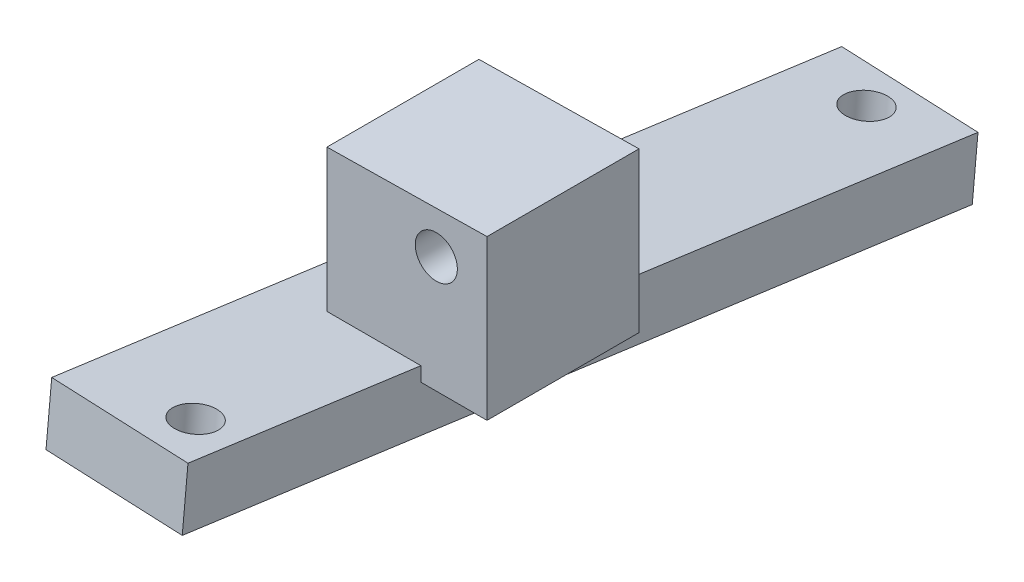
ISO-10303-21;
HEADER;
FILE_DESCRIPTION(('STEP AP214'),'2;1');
FILE_NAME('part.step','',(''),(''),'','','');
FILE_SCHEMA(('AUTOMOTIVE_DESIGN { 1 0 10303 214 1 1 1 1 }'));
ENDSEC;
DATA;
#1=APPLICATION_CONTEXT('core data for automotive mechanical design processes');
#2=APPLICATION_PROTOCOL_DEFINITION('international standard','automotive_design',2000,#1);
#3=PRODUCT_CONTEXT('',#1,'mechanical');
#4=PRODUCT('Part','Part','',(#3));
#5=PRODUCT_RELATED_PRODUCT_CATEGORY('part','',(#4));
#6=PRODUCT_DEFINITION_FORMATION('','',#4);
#7=PRODUCT_DEFINITION_CONTEXT('part definition',#1,'design');
#8=PRODUCT_DEFINITION('design','',#6,#7);
#9=PRODUCT_DEFINITION_SHAPE('','',#8);
#10=(LENGTH_UNIT() NAMED_UNIT(*) SI_UNIT(.MILLI.,.METRE.));
#11=(NAMED_UNIT(*) PLANE_ANGLE_UNIT() SI_UNIT($,.RADIAN.));
#12=(NAMED_UNIT(*) SI_UNIT($,.STERADIAN.) SOLID_ANGLE_UNIT());
#13=UNCERTAINTY_MEASURE_WITH_UNIT(LENGTH_MEASURE(1.E-05),#10,'distance_accuracy_value','');
#14=(GEOMETRIC_REPRESENTATION_CONTEXT(3) GLOBAL_UNCERTAINTY_ASSIGNED_CONTEXT((#13)) GLOBAL_UNIT_ASSIGNED_CONTEXT((#10,
#11,#12)) REPRESENTATION_CONTEXT('',''));
#15=CARTESIAN_POINT('',(0.,0.,0.));
#16=DIRECTION('',(0.,0.,1.));
#17=DIRECTION('',(1.,0.,0.));
#18=AXIS2_PLACEMENT_3D('',#15,#16,#17);
#19=CARTESIAN_POINT('',(0.,0.,0.));
#20=DIRECTION('',(0.,0.,-1.));
#21=DIRECTION('',(1.,0.,0.));
#22=AXIS2_PLACEMENT_3D('',#19,#20,#21);
#23=PLANE('',#22);
#24=DIRECTION('',(0.,1.,0.));
#25=VECTOR('',#24,1.);
#26=CARTESIAN_POINT('',(-277.356124968702,241.722821642749,0.));
#27=LINE('',#26,#25);
#28=CARTESIAN_POINT('',(-277.356124968702,240.280672700296,0.));
#29=VERTEX_POINT('',#28);
#30=CARTESIAN_POINT('',(-277.356124968702,264.279078056228,0.));
#31=VERTEX_POINT('',#30);
#32=EDGE_CURVE('E163',#29,#31,#27,.T.);
#33=ORIENTED_EDGE('',*,*,#32,.T.);
#34=DIRECTION('',(-0.999876642654605,-0.0157066697220126,0.));
#35=VECTOR('',#34,1.);
#36=CARTESIAN_POINT('',(-277.356124968702,264.279078056228,0.));
#37=LINE('',#36,#35);
#38=CARTESIAN_POINT('',(-301.486124968702,263.900029357395,0.));
#39=VERTEX_POINT('',#38);
#40=EDGE_CURVE('E137',#31,#39,#37,.T.);
#41=ORIENTED_EDGE('',*,*,#40,.T.);
#42=DIRECTION('',(0.,-1.,0.));
#43=VECTOR('',#42,1.);
#44=CARTESIAN_POINT('',(-301.486124968702,263.900029357395,0.));
#45=LINE('',#44,#43);
#46=CARTESIAN_POINT('',(-301.486124968702,242.442296150667,0.));
#47=VERTEX_POINT('',#46);
#48=EDGE_CURVE('E139',#39,#47,#45,.T.);
#49=ORIENTED_EDGE('',*,*,#48,.T.);
#50=DIRECTION('',(-1.,0.,0.));
#51=VECTOR('',#50,1.);
#52=CARTESIAN_POINT('',(0.,242.442296150667,0.));
#53=LINE('',#52,#51);
#54=CARTESIAN_POINT('',(-287.322166316557,242.442296150667,0.));
#55=VERTEX_POINT('',#54);
#56=EDGE_CURVE('E154',#55,#47,#53,.T.);
#57=ORIENTED_EDGE('',*,*,#56,.F.);
#58=DIRECTION('',(-0.00455549334561604,0.999989623686355,0.));
#59=VECTOR('',#58,1.);
#60=CARTESIAN_POINT('',(-286.211770850912,-1.30384934669808,0.));
#61=LINE('',#60,#59);
#62=CARTESIAN_POINT('',(-287.312318953133,240.280672700296,0.));
#63=VERTEX_POINT('',#62);
#64=EDGE_CURVE('E172',#63,#55,#61,.T.);
#65=ORIENTED_EDGE('',*,*,#64,.F.);
#66=DIRECTION('',(-1.,0.,0.));
#67=VECTOR('',#66,1.);
#68=CARTESIAN_POINT('',(-301.486124968702,240.280672700296,0.));
#69=LINE('',#68,#67);
#70=EDGE_CURVE('E223',#29,#63,#69,.T.);
#71=ORIENTED_EDGE('',*,*,#70,.F.);
#72=EDGE_LOOP('',(#33,#41,#49,#57,#65,#71));
#73=FACE_BOUND('',#72,.T.);
#74=CARTESIAN_POINT('',(-284.999999999996,257.808220007844,0.));
#75=DIRECTION('',(0.,0.,1.));
#76=DIRECTION('',(1.,0.,0.));
#77=AXIS2_PLACEMENT_3D('',#74,#75,#76);
#78=CIRCLE('',#77,3.17499999999758);
#79=CARTESIAN_POINT('',(-281.824999999998,257.808220007844,0.));
#80=VERTEX_POINT('',#79);
#81=EDGE_CURVE('E169',#80,#80,#78,.T.);
#82=ORIENTED_EDGE('',*,*,#81,.F.);
#83=EDGE_LOOP('',(#82));
#84=FACE_BOUND('',#83,.T.);
#85=ADVANCED_FACE('F41',(#73,#84),#23,.F.);
#86=CARTESIAN_POINT('',(-277.356124968702,241.722821642749,-56.2017164877576));
#87=DIRECTION('',(-1.,0.,0.));
#88=DIRECTION('',(0.,0.,-1.));
#89=AXIS2_PLACEMENT_3D('',#86,#87,#88);
#90=PLANE('',#89);
#91=DIRECTION('',(0.,0.,1.));
#92=VECTOR('',#91,1.);
#93=CARTESIAN_POINT('',(-277.356124968702,264.279078056228,-56.2017164877576));
#94=LINE('',#93,#92);
#95=CARTESIAN_POINT('',(-277.356124968702,264.279078056228,-22.9108));
#96=VERTEX_POINT('',#95);
#97=EDGE_CURVE('E142',#96,#31,#94,.T.);
#98=ORIENTED_EDGE('',*,*,#97,.T.);
#99=ORIENTED_EDGE('',*,*,#32,.F.);
#100=DIRECTION('',(0.,0.,-1.));
#101=VECTOR('',#100,1.);
#102=CARTESIAN_POINT('',(-277.356124968702,240.280672700296,24.1730571829924));
#103=LINE('',#102,#101);
#104=CARTESIAN_POINT('',(-277.356124968702,240.280672700296,-22.9108));
#105=VERTEX_POINT('',#104);
#106=EDGE_CURVE('E131',#29,#105,#103,.T.);
#107=ORIENTED_EDGE('',*,*,#106,.T.);
#108=DIRECTION('',(0.,-1.,0.));
#109=VECTOR('',#108,1.);
#110=CARTESIAN_POINT('',(-277.356124968702,241.722821642749,-22.9108));
#111=LINE('',#110,#109);
#112=EDGE_CURVE('E123',#96,#105,#111,.T.);
#113=ORIENTED_EDGE('',*,*,#112,.F.);
#114=EDGE_LOOP('',(#98,#99,#107,#113));
#115=FACE_BOUND('',#114,.T.);
#116=ADVANCED_FACE('F227',(#115),#90,.F.);
#117=CARTESIAN_POINT('',(-277.356124968702,264.279078056228,-56.2017164877576));
#118=DIRECTION('',(0.0157066697220126,-0.999876642654605,0.));
#119=DIRECTION('',(0.999876642654605,0.0157066697220126,0.));
#120=AXIS2_PLACEMENT_3D('',#117,#118,#119);
#121=PLANE('',#120);
#122=DIRECTION('',(0.,0.,1.));
#123=VECTOR('',#122,1.);
#124=CARTESIAN_POINT('',(-301.486124968702,263.900029357395,-56.2017164877576));
#125=LINE('',#124,#123);
#126=CARTESIAN_POINT('',(-301.486124968702,263.900029357395,-22.9108));
#127=VERTEX_POINT('',#126);
#128=EDGE_CURVE('E136',#127,#39,#125,.T.);
#129=ORIENTED_EDGE('',*,*,#128,.T.);
#130=ORIENTED_EDGE('',*,*,#40,.F.);
#131=ORIENTED_EDGE('',*,*,#97,.F.);
#132=DIRECTION('',(0.999876642654605,0.0157066697220126,0.));
#133=VECTOR('',#132,1.);
#134=CARTESIAN_POINT('',(-277.356124968702,264.279078056228,-22.9108));
#135=LINE('',#134,#133);
#136=EDGE_CURVE('E146',#127,#96,#135,.T.);
#137=ORIENTED_EDGE('',*,*,#136,.F.);
#138=EDGE_LOOP('',(#129,#130,#131,#137));
#139=FACE_BOUND('',#138,.T.);
#140=ADVANCED_FACE('F166',(#139),#121,.F.);
#141=CARTESIAN_POINT('',(-301.486124968702,263.900029357395,-56.2017164877576));
#142=DIRECTION('',(1.,0.,0.));
#143=DIRECTION('',(0.,0.,1.));
#144=AXIS2_PLACEMENT_3D('',#141,#142,#143);
#145=PLANE('',#144);
#146=ORIENTED_EDGE('',*,*,#48,.F.);
#147=ORIENTED_EDGE('',*,*,#128,.F.);
#148=DIRECTION('',(0.,1.,0.));
#149=VECTOR('',#148,1.);
#150=CARTESIAN_POINT('',(-301.486124968702,263.900029357395,-22.9108));
#151=LINE('',#150,#149);
#152=CARTESIAN_POINT('',(-301.486124968702,240.280672700296,-22.9108));
#153=VERTEX_POINT('',#152);
#154=EDGE_CURVE('E120',#153,#127,#151,.T.);
#155=ORIENTED_EDGE('',*,*,#154,.F.);
#156=DIRECTION('',(0.,0.,-1.));
#157=VECTOR('',#156,1.);
#158=CARTESIAN_POINT('',(-301.486124968702,240.280672700296,24.1730571829924));
#159=LINE('',#158,#157);
#160=CARTESIAN_POINT('',(-301.486124968702,240.280672700296,-22.5414093404712));
#161=VERTEX_POINT('',#160);
#162=EDGE_CURVE('E126',#161,#153,#159,.T.);
#163=ORIENTED_EDGE('',*,*,#162,.F.);
#164=DIRECTION('',(0.,-0.0954577562183398,-0.995433481844849));
#165=VECTOR('',#164,1.);
#166=CARTESIAN_POINT('',(-301.486124968702,237.297432062091,-53.6506427156725));
#167=LINE('',#166,#165);
#168=EDGE_CURVE('E49',#47,#161,#167,.T.);
#169=ORIENTED_EDGE('',*,*,#168,.F.);
#170=EDGE_LOOP('',(#146,#147,#155,#163,#169));
#171=FACE_BOUND('',#170,.T.);
#172=ADVANCED_FACE('F135',(#171),#145,.F.);
#173=CARTESIAN_POINT('',(-284.999999999996,257.808220007844,-56.2017164877576));
#174=DIRECTION('',(0.,0.,1.));
#175=DIRECTION('',(-1.,0.,0.));
#176=AXIS2_PLACEMENT_3D('',#173,#174,#175);
#177=CYLINDRICAL_SURFACE('',#176,3.17499999999758);
#178=CARTESIAN_POINT('',(-284.999999999996,257.808220007844,-22.9108));
#179=DIRECTION('',(0.,0.,-1.));
#180=DIRECTION('',(0.,1.,0.));
#181=AXIS2_PLACEMENT_3D('',#178,#179,#180);
#182=CIRCLE('',#181,3.17499999999758);
#183=CARTESIAN_POINT('',(-284.999999999996,260.983220007842,-22.9108));
#184=VERTEX_POINT('',#183);
#185=EDGE_CURVE('E148',#184,#184,#182,.T.);
#186=ORIENTED_EDGE('',*,*,#185,.T.);
#187=EDGE_LOOP('',(#186));
#188=FACE_BOUND('',#187,.T.);
#189=ORIENTED_EDGE('',*,*,#81,.T.);
#190=EDGE_LOOP('',(#189));
#191=FACE_BOUND('',#190,.T.);
#192=ADVANCED_FACE('F237',(#188,#191),#177,.F.);
#193=CARTESIAN_POINT('',(-259.570136956663,305.935789375131,-22.9108));
#194=DIRECTION('',(0.,0.,1.));
#195=DIRECTION('',(0.,1.,0.));
#196=AXIS2_PLACEMENT_3D('',#193,#194,#195);
#197=PLANE('',#196);
#198=ORIENTED_EDGE('',*,*,#185,.F.);
#199=EDGE_LOOP('',(#198));
#200=FACE_BOUND('',#199,.T.);
#201=ORIENTED_EDGE('',*,*,#112,.T.);
#202=DIRECTION('',(1.,0.,0.));
#203=VECTOR('',#202,1.);
#204=CARTESIAN_POINT('',(-301.486124968702,240.280672700296,-22.9108));
#205=LINE('',#204,#203);
#206=EDGE_CURVE('E117',#153,#105,#205,.T.);
#207=ORIENTED_EDGE('',*,*,#206,.F.);
#208=ORIENTED_EDGE('',*,*,#154,.T.);
#209=ORIENTED_EDGE('',*,*,#136,.T.);
#210=EDGE_LOOP('',(#201,#207,#208,#209));
#211=FACE_BOUND('',#210,.T.);
#212=ADVANCED_FACE('F43',(#200,#211),#197,.F.);
#213=CARTESIAN_POINT('',(-283.47997891957,107.975046286893,-67.9845133997112));
#214=DIRECTION('',(0.998863194012666,0.00455036184948723,0.0474511733664595));
#215=DIRECTION('',(-0.0474516646311742,0.,0.998873535300506));
#216=AXIS2_PLACEMENT_3D('',#213,#214,#215);
#217=PLANE('',#216);
#218=DIRECTION('',(-0.0474516646311742,0.,0.998873535300506));
#219=VECTOR('',#218,1.);
#220=CARTESIAN_POINT('',(-284.081345445302,240.280672700296,-68.0130814232808));
#221=LINE('',#220,#219);
#222=CARTESIAN_POINT('',(-286.241485300487,240.280672700296,-22.541409340473));
#223=VERTEX_POINT('',#222);
#224=EDGE_CURVE('E56',#223,#63,#221,.T.);
#225=ORIENTED_EDGE('',*,*,#224,.T.);
#226=ORIENTED_EDGE('',*,*,#64,.T.);
#227=DIRECTION('',(-0.0476688540539319,0.0953492392695333,0.994301867102695));
#228=VECTOR('',#227,1.);
#229=CARTESIAN_POINT('',(-283.47997891957,234.756991926252,-80.1423524522006));
#230=LINE('',#229,#228);
#231=CARTESIAN_POINT('',(-288.928528937934,245.65540997476,33.5063509576376));
#232=VERTEX_POINT('',#231);
#233=EDGE_CURVE('E221',#55,#232,#230,.T.);
#234=ORIENTED_EDGE('',*,*,#233,.T.);
#235=DIRECTION('',(0.,0.995433481844849,-0.0954577562183399));
#236=VECTOR('',#235,1.);
#237=CARTESIAN_POINT('',(-288.928528937934,118.873464335401,45.6641900101269));
#238=LINE('',#237,#236);
#239=CARTESIAN_POINT('',(-288.928528937934,236.657350143949,34.3692258934659));
#240=VERTEX_POINT('',#239);
#241=EDGE_CURVE('E193',#240,#232,#238,.T.);
#242=ORIENTED_EDGE('',*,*,#241,.F.);
#243=DIRECTION('',(-0.0476688540539319,0.0953492392695333,0.994301867102695));
#244=VECTOR('',#243,1.);
#245=CARTESIAN_POINT('',(-283.47997891957,225.758932095441,-79.2794775163729));
#246=LINE('',#245,#244);
#247=CARTESIAN_POINT('',(-283.47997891957,225.758932095441,-79.2794775163729));
#248=VERTEX_POINT('',#247);
#249=EDGE_CURVE('E183',#248,#240,#246,.T.);
#250=ORIENTED_EDGE('',*,*,#249,.F.);
#251=DIRECTION('',(0.,0.995433481844849,-0.0954577562183399));
#252=VECTOR('',#251,1.);
#253=CARTESIAN_POINT('',(-283.47997891957,107.975046286893,-67.9845133997112));
#254=LINE('',#253,#252);
#255=CARTESIAN_POINT('',(-283.47997891957,234.756991926252,-80.1423524522006));
#256=VERTEX_POINT('',#255);
#257=EDGE_CURVE('E189',#248,#256,#254,.T.);
#258=ORIENTED_EDGE('',*,*,#257,.T.);
#259=EDGE_CURVE('E205',#256,#223,#230,.T.);
#260=ORIENTED_EDGE('',*,*,#259,.T.);
#261=EDGE_LOOP('',(#225,#226,#234,#242,#250,#258,#260));
#262=FACE_BOUND('',#261,.T.);
#263=ADVANCED_FACE('F244',(#262),#217,.T.);
#264=CARTESIAN_POINT('',(0.,240.233117527321,-23.0373146842464));
#265=DIRECTION('',(0.,0.995433481844849,-0.0954577562183398));
#266=DIRECTION('',(0.,-0.0954577562183398,-0.995433481844849));
#267=AXIS2_PLACEMENT_3D('',#264,#265,#266);
#268=PLANE('',#267);
#269=DIRECTION('',(1.,0.,0.));
#270=VECTOR('',#269,1.);
#271=CARTESIAN_POINT('',(0.,240.280672700296,-22.541409340472));
#272=LINE('',#271,#270);
#273=EDGE_CURVE('E11',#161,#223,#272,.T.);
#274=ORIENTED_EDGE('',*,*,#273,.T.);
#275=ORIENTED_EDGE('',*,*,#259,.F.);
#276=DIRECTION('',(0.998863194012666,0.00455036184948762,0.0474511733664596));
#277=VECTOR('',#276,1.);
#278=CARTESIAN_POINT('',(-305.045435278303,234.658749613922,-81.1668232851824));
#279=LINE('',#278,#277);
#280=CARTESIAN_POINT('',(-305.045435278303,234.658749613922,-81.1668232851824));
#281=VERTEX_POINT('',#280);
#282=EDGE_CURVE('E219',#281,#256,#279,.T.);
#283=ORIENTED_EDGE('',*,*,#282,.F.);
#284=DIRECTION('',(0.0476688540539319,-0.0953492392695333,-0.994301867102695));
#285=VECTOR('',#284,1.);
#286=CARTESIAN_POINT('',(-310.493985296667,245.557167662429,32.4818801246557));
#287=LINE('',#286,#285);
#288=CARTESIAN_POINT('',(-310.493985296667,245.557167662429,32.4818801246557));
#289=VERTEX_POINT('',#288);
#290=EDGE_CURVE('E216',#289,#281,#287,.T.);
#291=ORIENTED_EDGE('',*,*,#290,.F.);
#292=DIRECTION('',(-0.998863194012666,-0.00455036184948762,-0.0474511733664603));
#293=VECTOR('',#292,1.);
#294=CARTESIAN_POINT('',(-288.928528937934,245.65540997476,33.5063509576376));
#295=LINE('',#294,#293);
#296=EDGE_CURVE('E211',#232,#289,#295,.T.);
#297=ORIENTED_EDGE('',*,*,#296,.F.);
#298=ORIENTED_EDGE('',*,*,#233,.F.);
#299=ORIENTED_EDGE('',*,*,#56,.T.);
#300=ORIENTED_EDGE('',*,*,#168,.T.);
#301=EDGE_LOOP('',(#274,#275,#283,#291,#297,#298,#299,#300));
#302=FACE_BOUND('',#301,.T.);
#303=CARTESIAN_POINT('',(-294.821428571425,244.980091477953,26.4641296729373));
#304=DIRECTION('',(0.,-0.995433481844849,0.0954577562183399));
#305=DIRECTION('',(0.,-0.0954577562183399,-0.995433481844849));
#306=AXIS2_PLACEMENT_3D('',#303,#304,#305);
#307=CIRCLE('',#306,3.17499999999997);
#308=CARTESIAN_POINT('',(-294.821428571425,244.67701310196,23.3036283680799));
#309=VERTEX_POINT('',#308);
#310=EDGE_CURVE('E187',#309,#309,#307,.T.);
#311=ORIENTED_EDGE('',*,*,#310,.T.);
#312=EDGE_LOOP('',(#311));
#313=FACE_BOUND('',#312,.T.);
#314=CARTESIAN_POINT('',(-294.821428571423,235.28158344617,-74.6719120824994));
#315=DIRECTION('',(0.,-0.995433481844849,0.0954577562183399));
#316=DIRECTION('',(0.,-0.0954577562183399,-0.995433481844849));
#317=AXIS2_PLACEMENT_3D('',#314,#315,#316);
#318=CIRCLE('',#317,3.17499999999997);
#319=CARTESIAN_POINT('',(-294.821428571423,234.978505070176,-77.8324133873568));
#320=VERTEX_POINT('',#319);
#321=EDGE_CURVE('E208',#320,#320,#318,.T.);
#322=ORIENTED_EDGE('',*,*,#321,.T.);
#323=EDGE_LOOP('',(#322));
#324=FACE_BOUND('',#323,.T.);
#325=ADVANCED_FACE('F151',(#302,#313,#324),#268,.T.);
#326=CARTESIAN_POINT('',(-288.928528937934,118.873464335401,45.6641900101269));
#327=DIRECTION('',(-0.0476688540539327,0.0953492392695335,0.994301867102695));
#328=DIRECTION('',(0.,0.995433481844849,-0.0954577562183399));
#329=AXIS2_PLACEMENT_3D('',#326,#327,#328);
#330=PLANE('',#329);
#331=ORIENTED_EDGE('',*,*,#241,.T.);
#332=ORIENTED_EDGE('',*,*,#296,.T.);
#333=DIRECTION('',(0.,0.995433481844849,-0.0954577562183399));
#334=VECTOR('',#333,1.);
#335=CARTESIAN_POINT('',(-310.493985296668,118.77522202307,44.639719177145));
#336=LINE('',#335,#334);
#337=CARTESIAN_POINT('',(-310.493985296668,236.559107831618,33.344755060484));
#338=VERTEX_POINT('',#337);
#339=EDGE_CURVE('E181',#338,#289,#336,.T.);
#340=ORIENTED_EDGE('',*,*,#339,.F.);
#341=DIRECTION('',(-0.998863194012666,-0.00455036184948739,-0.0474511733664603));
#342=VECTOR('',#341,1.);
#343=CARTESIAN_POINT('',(-288.928528937934,236.657350143949,34.3692258934652));
#344=LINE('',#343,#342);
#345=EDGE_CURVE('E184',#240,#338,#344,.T.);
#346=ORIENTED_EDGE('',*,*,#345,.F.);
#347=EDGE_LOOP('',(#331,#332,#340,#346));
#348=FACE_BOUND('',#347,.T.);
#349=ADVANCED_FACE('F263',(#348),#330,.T.);
#350=CARTESIAN_POINT('',(-305.045435278303,107.876803974563,-69.0089842326931));
#351=DIRECTION('',(0.0476688540539321,-0.0953492392695335,-0.994301867102695));
#352=DIRECTION('',(0.,-0.995433481844849,0.0954577562183399));
#353=AXIS2_PLACEMENT_3D('',#350,#351,#352);
#354=PLANE('',#353);
#355=DIRECTION('',(0.,0.995433481844849,-0.0954577562183399));
#356=VECTOR('',#355,1.);
#357=CARTESIAN_POINT('',(-305.045435278303,107.876803974563,-69.0089842326931));
#358=LINE('',#357,#356);
#359=CARTESIAN_POINT('',(-305.045435278303,225.66068978311,-80.3039483493547));
#360=VERTEX_POINT('',#359);
#361=EDGE_CURVE('E185',#360,#281,#358,.T.);
#362=ORIENTED_EDGE('',*,*,#361,.T.);
#363=ORIENTED_EDGE('',*,*,#282,.T.);
#364=ORIENTED_EDGE('',*,*,#257,.F.);
#365=DIRECTION('',(0.998863194012666,0.00455036184948733,0.0474511733664596));
#366=VECTOR('',#365,1.);
#367=CARTESIAN_POINT('',(-305.045435278303,225.66068978311,-80.3039483493547));
#368=LINE('',#367,#366);
#369=EDGE_CURVE('E192',#360,#248,#368,.T.);
#370=ORIENTED_EDGE('',*,*,#369,.F.);
#371=EDGE_LOOP('',(#362,#363,#364,#370));
#372=FACE_BOUND('',#371,.T.);
#373=ADVANCED_FACE('F266',(#372),#354,.T.);
#374=CARTESIAN_POINT('',(-310.493985296668,118.77522202307,44.639719177145));
#375=DIRECTION('',(-0.998863194012666,-0.00455036184948723,-0.0474511733664595));
#376=DIRECTION('',(0.0474516646311742,0.,-0.998873535300506));
#377=AXIS2_PLACEMENT_3D('',#374,#375,#376);
#378=PLANE('',#377);
#379=ORIENTED_EDGE('',*,*,#339,.T.);
#380=ORIENTED_EDGE('',*,*,#290,.T.);
#381=ORIENTED_EDGE('',*,*,#361,.F.);
#382=DIRECTION('',(0.0476688540539319,-0.0953492392695333,-0.994301867102695));
#383=VECTOR('',#382,1.);
#384=CARTESIAN_POINT('',(-310.493985296667,236.559107831618,33.3447550604834));
#385=LINE('',#384,#383);
#386=EDGE_CURVE('E188',#338,#360,#385,.T.);
#387=ORIENTED_EDGE('',*,*,#386,.F.);
#388=EDGE_LOOP('',(#379,#380,#381,#387));
#389=FACE_BOUND('',#388,.T.);
#390=ADVANCED_FACE('F261',(#389),#378,.T.);
#391=CARTESIAN_POINT('',(-294.821428571425,118.198145838594,38.6219687254266));
#392=DIRECTION('',(0.,0.995433481844849,-0.0954577562183399));
#393=DIRECTION('',(0.,-0.0954577562183399,-0.995433481844849));
#394=AXIS2_PLACEMENT_3D('',#391,#392,#393);
#395=CYLINDRICAL_SURFACE('',#394,3.17499999999997);
#396=ORIENTED_EDGE('',*,*,#310,.F.);
#397=EDGE_LOOP('',(#396));
#398=FACE_BOUND('',#397,.T.);
#399=CARTESIAN_POINT('',(-294.821428571425,235.982031647142,27.327004608765));
#400=DIRECTION('',(0.,0.995433481844849,-0.0954577562183398));
#401=DIRECTION('',(0.,0.0954577562183398,0.995433481844849));
#402=AXIS2_PLACEMENT_3D('',#399,#400,#401);
#403=CIRCLE('',#402,3.17499999999997);
#404=CARTESIAN_POINT('',(-294.821428571425,236.285110023135,30.4875059136223));
#405=VERTEX_POINT('',#404);
#406=EDGE_CURVE('E178',#405,#405,#403,.F.);
#407=ORIENTED_EDGE('',*,*,#406,.T.);
#408=EDGE_LOOP('',(#407));
#409=FACE_BOUND('',#408,.T.);
#410=ADVANCED_FACE('F257',(#398,#409),#395,.F.);
#411=CARTESIAN_POINT('',(-294.821428571423,108.499637806811,-62.5140730300101));
#412=DIRECTION('',(0.,0.995433481844849,-0.0954577562183399));
#413=DIRECTION('',(0.,-0.0954577562183399,-0.995433481844849));
#414=AXIS2_PLACEMENT_3D('',#411,#412,#413);
#415=CYLINDRICAL_SURFACE('',#414,3.17499999999997);
#416=ORIENTED_EDGE('',*,*,#321,.F.);
#417=EDGE_LOOP('',(#416));
#418=FACE_BOUND('',#417,.T.);
#419=CARTESIAN_POINT('',(-294.821428571423,226.283523615359,-73.8090371466717));
#420=DIRECTION('',(0.,0.995433481844849,-0.0954577562183398));
#421=DIRECTION('',(0.,0.0954577562183398,0.995433481844849));
#422=AXIS2_PLACEMENT_3D('',#419,#420,#421);
#423=CIRCLE('',#422,3.17499999999997);
#424=CARTESIAN_POINT('',(-294.821428571423,226.586601991352,-70.6485358418144));
#425=VERTEX_POINT('',#424);
#426=EDGE_CURVE('E202',#425,#425,#423,.F.);
#427=ORIENTED_EDGE('',*,*,#426,.T.);
#428=EDGE_LOOP('',(#427));
#429=FACE_BOUND('',#428,.T.);
#430=ADVANCED_FACE('F253',(#418,#429),#415,.F.);
#431=CARTESIAN_POINT('',(-294.821428571425,235.982031647142,27.3270046087648));
#432=DIRECTION('',(0.,-0.995433481844849,0.0954577562183398));
#433=DIRECTION('',(-0.546944138603984,-0.0799142842747756,-0.833346156417366));
#434=AXIS2_PLACEMENT_3D('',#431,#432,#433);
#435=PLANE('',#434);
#436=ORIENTED_EDGE('',*,*,#345,.T.);
#437=ORIENTED_EDGE('',*,*,#386,.T.);
#438=ORIENTED_EDGE('',*,*,#369,.T.);
#439=ORIENTED_EDGE('',*,*,#249,.T.);
#440=EDGE_LOOP('',(#436,#437,#438,#439));
#441=FACE_BOUND('',#440,.T.);
#442=ORIENTED_EDGE('',*,*,#426,.F.);
#443=EDGE_LOOP('',(#442));
#444=FACE_BOUND('',#443,.T.);
#445=ORIENTED_EDGE('',*,*,#406,.F.);
#446=EDGE_LOOP('',(#445));
#447=FACE_BOUND('',#446,.T.);
#448=ADVANCED_FACE('F250',(#441,#444,#447),#435,.T.);
#449=CARTESIAN_POINT('',(-301.486124968702,240.280672700296,24.1730571829924));
#450=DIRECTION('',(0.,-1.,0.));
#451=DIRECTION('',(0.,0.,1.));
#452=AXIS2_PLACEMENT_3D('',#449,#450,#451);
#453=PLANE('',#452);
#454=ORIENTED_EDGE('',*,*,#273,.F.);
#455=ORIENTED_EDGE('',*,*,#162,.T.);
#456=ORIENTED_EDGE('',*,*,#206,.T.);
#457=ORIENTED_EDGE('',*,*,#106,.F.);
#458=ORIENTED_EDGE('',*,*,#70,.T.);
#459=ORIENTED_EDGE('',*,*,#224,.F.);
#460=EDGE_LOOP('',(#454,#455,#456,#457,#458,#459));
#461=FACE_BOUND('',#460,.T.);
#462=ADVANCED_FACE('F129',(#461),#453,.T.);
#463=CLOSED_SHELL('',(#85,#116,#140,#172,#192,#212,#263,#325,#349,#373,#390,#410,#430,#448,#462));
#464=MANIFOLD_SOLID_BREP('B2',#463);
#465=ADVANCED_BREP_SHAPE_REPRESENTATION('',(#18,#464),#14);
#466=SHAPE_DEFINITION_REPRESENTATION(#9,#465);
ENDSEC;
END-ISO-10303-21;
